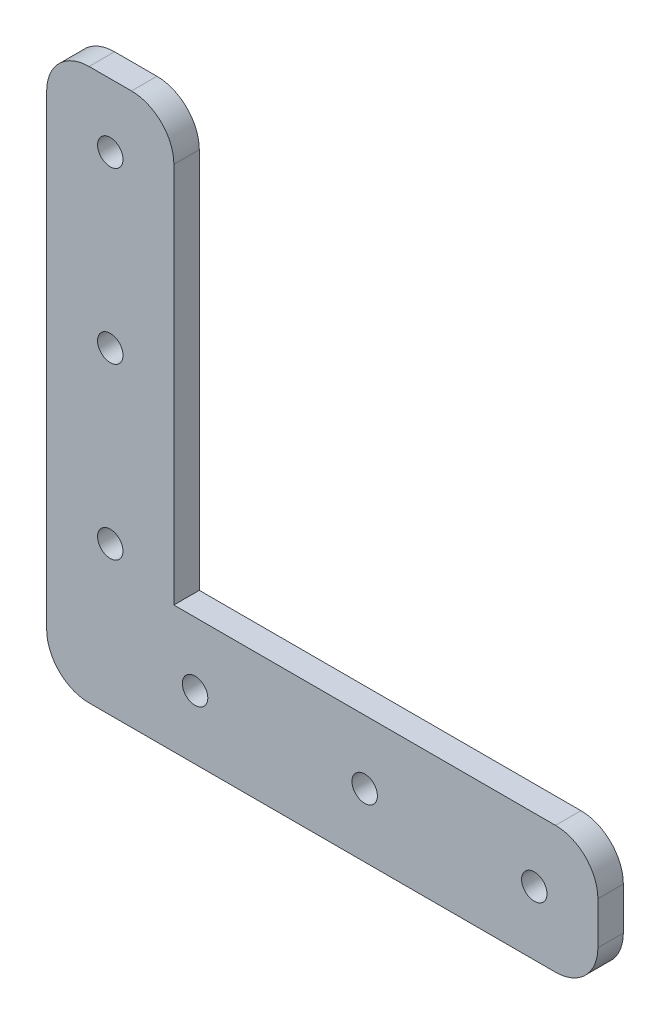
ISO-10303-21;
HEADER;
FILE_DESCRIPTION(('STEP AP214'),'2;1');
FILE_NAME('part.step','',(''),(''),'','','');
FILE_SCHEMA(('AUTOMOTIVE_DESIGN { 1 0 10303 214 1 1 1 1 }'));
ENDSEC;
DATA;
#1=APPLICATION_CONTEXT('core data for automotive mechanical design processes');
#2=APPLICATION_PROTOCOL_DEFINITION('international standard','automotive_design',2000,#1);
#3=PRODUCT_CONTEXT('',#1,'mechanical');
#4=PRODUCT('Part','Part','',(#3));
#5=PRODUCT_RELATED_PRODUCT_CATEGORY('part','',(#4));
#6=PRODUCT_DEFINITION_FORMATION('','',#4);
#7=PRODUCT_DEFINITION_CONTEXT('part definition',#1,'design');
#8=PRODUCT_DEFINITION('design','',#6,#7);
#9=PRODUCT_DEFINITION_SHAPE('','',#8);
#10=(LENGTH_UNIT() NAMED_UNIT(*) SI_UNIT(.MILLI.,.METRE.));
#11=(NAMED_UNIT(*) PLANE_ANGLE_UNIT() SI_UNIT($,.RADIAN.));
#12=(NAMED_UNIT(*) SI_UNIT($,.STERADIAN.) SOLID_ANGLE_UNIT());
#13=UNCERTAINTY_MEASURE_WITH_UNIT(LENGTH_MEASURE(1.E-05),#10,'distance_accuracy_value','');
#14=(GEOMETRIC_REPRESENTATION_CONTEXT(3) GLOBAL_UNCERTAINTY_ASSIGNED_CONTEXT((#13)) GLOBAL_UNIT_ASSIGNED_CONTEXT((#10,
#11,#12)) REPRESENTATION_CONTEXT('',''));
#15=CARTESIAN_POINT('',(0.,0.,0.));
#16=DIRECTION('',(0.,0.,1.));
#17=DIRECTION('',(1.,0.,0.));
#18=AXIS2_PLACEMENT_3D('',#15,#16,#17);
#19=CARTESIAN_POINT('',(0.,0.,3.));
#20=DIRECTION('',(0.,0.,-1.));
#21=DIRECTION('',(-1.,0.,0.));
#22=AXIS2_PLACEMENT_3D('',#19,#20,#21);
#23=PLANE('',#22);
#24=DIRECTION('',(0.,1.,0.));
#25=VECTOR('',#24,1.);
#26=CARTESIAN_POINT('',(65.,15.0000000000001,3.));
#27=LINE('',#26,#25);
#28=CARTESIAN_POINT('',(65.,5.,3.));
#29=VERTEX_POINT('',#28);
#30=CARTESIAN_POINT('',(65.,10.0000000000001,3.));
#31=VERTEX_POINT('',#30);
#32=EDGE_CURVE('E129',#29,#31,#27,.T.);
#33=ORIENTED_EDGE('',*,*,#32,.T.);
#34=CARTESIAN_POINT('',(60.,10.0000000000001,3.));
#35=DIRECTION('',(0.,0.,-1.));
#36=DIRECTION('',(-1.,0.,0.));
#37=AXIS2_PLACEMENT_3D('',#34,#35,#36);
#38=CIRCLE('',#37,5.);
#39=CARTESIAN_POINT('',(60.,15.0000000000001,3.));
#40=VERTEX_POINT('',#39);
#41=EDGE_CURVE('E125',#31,#40,#38,.F.);
#42=ORIENTED_EDGE('',*,*,#41,.T.);
#43=DIRECTION('',(-1.,0.,0.));
#44=VECTOR('',#43,1.);
#45=CARTESIAN_POINT('',(15.,15.,3.));
#46=LINE('',#45,#44);
#47=CARTESIAN_POINT('',(15.,15.,3.));
#48=VERTEX_POINT('',#47);
#49=EDGE_CURVE('E117',#40,#48,#46,.T.);
#50=ORIENTED_EDGE('',*,*,#49,.T.);
#51=DIRECTION('',(0.,1.,0.));
#52=VECTOR('',#51,1.);
#53=CARTESIAN_POINT('',(15.,65.,3.));
#54=LINE('',#53,#52);
#55=CARTESIAN_POINT('',(15.,60.,3.));
#56=VERTEX_POINT('',#55);
#57=EDGE_CURVE('E122',#48,#56,#54,.T.);
#58=ORIENTED_EDGE('',*,*,#57,.T.);
#59=CARTESIAN_POINT('',(9.99999999999999,60.,3.));
#60=DIRECTION('',(0.,0.,-1.));
#61=DIRECTION('',(-1.,0.,0.));
#62=AXIS2_PLACEMENT_3D('',#59,#60,#61);
#63=CIRCLE('',#62,5.);
#64=CARTESIAN_POINT('',(9.99999999999999,65.,3.));
#65=VERTEX_POINT('',#64);
#66=EDGE_CURVE('E188',#56,#65,#63,.F.);
#67=ORIENTED_EDGE('',*,*,#66,.T.);
#68=DIRECTION('',(-1.,0.,0.));
#69=VECTOR('',#68,1.);
#70=CARTESIAN_POINT('',(0.,65.,3.));
#71=LINE('',#70,#69);
#72=CARTESIAN_POINT('',(5.,65.,3.));
#73=VERTEX_POINT('',#72);
#74=EDGE_CURVE('E145',#65,#73,#71,.T.);
#75=ORIENTED_EDGE('',*,*,#74,.T.);
#76=CARTESIAN_POINT('',(5.,60.,3.));
#77=DIRECTION('',(0.,0.,-1.));
#78=DIRECTION('',(-1.,0.,0.));
#79=AXIS2_PLACEMENT_3D('',#76,#77,#78);
#80=CIRCLE('',#79,5.);
#81=CARTESIAN_POINT('',(0.,60.,3.));
#82=VERTEX_POINT('',#81);
#83=EDGE_CURVE('E55',#73,#82,#80,.F.);
#84=ORIENTED_EDGE('',*,*,#83,.T.);
#85=DIRECTION('',(0.,-1.,0.));
#86=VECTOR('',#85,1.);
#87=CARTESIAN_POINT('',(0.,0.,3.));
#88=LINE('',#87,#86);
#89=CARTESIAN_POINT('',(0.,5.,3.));
#90=VERTEX_POINT('',#89);
#91=EDGE_CURVE('E140',#82,#90,#88,.T.);
#92=ORIENTED_EDGE('',*,*,#91,.T.);
#93=CARTESIAN_POINT('',(5.,5.,3.));
#94=DIRECTION('',(0.,0.,-1.));
#95=DIRECTION('',(-1.,0.,0.));
#96=AXIS2_PLACEMENT_3D('',#93,#94,#95);
#97=CIRCLE('',#96,5.);
#98=CARTESIAN_POINT('',(5.,0.,3.));
#99=VERTEX_POINT('',#98);
#100=EDGE_CURVE('E186',#90,#99,#97,.F.);
#101=ORIENTED_EDGE('',*,*,#100,.T.);
#102=DIRECTION('',(1.,0.,0.));
#103=VECTOR('',#102,1.);
#104=CARTESIAN_POINT('',(65.,0.,3.));
#105=LINE('',#104,#103);
#106=CARTESIAN_POINT('',(60.,0.,3.));
#107=VERTEX_POINT('',#106);
#108=EDGE_CURVE('E165',#99,#107,#105,.T.);
#109=ORIENTED_EDGE('',*,*,#108,.T.);
#110=CARTESIAN_POINT('',(60.,5.,3.));
#111=DIRECTION('',(0.,0.,-1.));
#112=DIRECTION('',(-1.,0.,0.));
#113=AXIS2_PLACEMENT_3D('',#110,#111,#112);
#114=CIRCLE('',#113,5.);
#115=EDGE_CURVE('E184',#107,#29,#114,.F.);
#116=ORIENTED_EDGE('',*,*,#115,.T.);
#117=EDGE_LOOP('',(#33,#42,#50,#58,#67,#75,#84,#92,#101,#109,#116));
#118=FACE_BOUND('',#117,.T.);
#119=CARTESIAN_POINT('',(7.5,37.5,3.));
#120=DIRECTION('',(0.,0.,1.));
#121=DIRECTION('',(1.,0.,0.));
#122=AXIS2_PLACEMENT_3D('',#119,#120,#121);
#123=CIRCLE('',#122,1.5);
#124=CARTESIAN_POINT('',(9.00000000000001,37.5,3.));
#125=VERTEX_POINT('',#124);
#126=EDGE_CURVE('E155',#125,#125,#123,.T.);
#127=ORIENTED_EDGE('',*,*,#126,.F.);
#128=EDGE_LOOP('',(#127));
#129=FACE_BOUND('',#128,.T.);
#130=CARTESIAN_POINT('',(7.5,57.5,3.));
#131=DIRECTION('',(0.,0.,1.));
#132=DIRECTION('',(1.,0.,0.));
#133=AXIS2_PLACEMENT_3D('',#130,#131,#132);
#134=CIRCLE('',#133,1.5);
#135=CARTESIAN_POINT('',(9.,57.5,3.));
#136=VERTEX_POINT('',#135);
#137=EDGE_CURVE('E226',#136,#136,#134,.T.);
#138=ORIENTED_EDGE('',*,*,#137,.F.);
#139=EDGE_LOOP('',(#138));
#140=FACE_BOUND('',#139,.T.);
#141=CARTESIAN_POINT('',(7.50000000000001,17.5,3.));
#142=DIRECTION('',(0.,0.,1.));
#143=DIRECTION('',(1.,0.,0.));
#144=AXIS2_PLACEMENT_3D('',#141,#142,#143);
#145=CIRCLE('',#144,1.5);
#146=CARTESIAN_POINT('',(9.00000000000001,17.5,3.));
#147=VERTEX_POINT('',#146);
#148=EDGE_CURVE('E232',#147,#147,#145,.T.);
#149=ORIENTED_EDGE('',*,*,#148,.F.);
#150=EDGE_LOOP('',(#149));
#151=FACE_BOUND('',#150,.T.);
#152=CARTESIAN_POINT('',(57.5,7.49999999999987,3.));
#153=DIRECTION('',(0.,0.,1.));
#154=DIRECTION('',(-1.,0.,0.));
#155=AXIS2_PLACEMENT_3D('',#152,#153,#154);
#156=CIRCLE('',#155,1.5);
#157=CARTESIAN_POINT('',(56.,7.49999999999987,3.));
#158=VERTEX_POINT('',#157);
#159=EDGE_CURVE('E238',#158,#158,#156,.T.);
#160=ORIENTED_EDGE('',*,*,#159,.F.);
#161=EDGE_LOOP('',(#160));
#162=FACE_BOUND('',#161,.T.);
#163=CARTESIAN_POINT('',(37.5,7.49999999999992,3.));
#164=DIRECTION('',(0.,0.,1.));
#165=DIRECTION('',(-1.,0.,0.));
#166=AXIS2_PLACEMENT_3D('',#163,#164,#165);
#167=CIRCLE('',#166,1.5);
#168=CARTESIAN_POINT('',(36.,7.49999999999992,3.));
#169=VERTEX_POINT('',#168);
#170=EDGE_CURVE('E244',#169,#169,#167,.T.);
#171=ORIENTED_EDGE('',*,*,#170,.F.);
#172=EDGE_LOOP('',(#171));
#173=FACE_BOUND('',#172,.T.);
#174=CARTESIAN_POINT('',(17.5,7.49999999999997,3.));
#175=DIRECTION('',(0.,0.,1.));
#176=DIRECTION('',(-1.,0.,0.));
#177=AXIS2_PLACEMENT_3D('',#174,#175,#176);
#178=CIRCLE('',#177,1.5);
#179=CARTESIAN_POINT('',(16.,7.49999999999997,3.));
#180=VERTEX_POINT('',#179);
#181=EDGE_CURVE('E250',#180,#180,#178,.T.);
#182=ORIENTED_EDGE('',*,*,#181,.F.);
#183=EDGE_LOOP('',(#182));
#184=FACE_BOUND('',#183,.T.);
#185=ADVANCED_FACE('F35',(#118,#129,#140,#151,#162,#173,#184),#23,.F.);
#186=CARTESIAN_POINT('',(0.,0.,0.));
#187=DIRECTION('',(0.,0.,-1.));
#188=DIRECTION('',(-1.,0.,0.));
#189=AXIS2_PLACEMENT_3D('',#186,#187,#188);
#190=PLANE('',#189);
#191=CARTESIAN_POINT('',(37.5,7.49999999999992,0.));
#192=DIRECTION('',(0.,0.,1.));
#193=DIRECTION('',(-1.,0.,0.));
#194=AXIS2_PLACEMENT_3D('',#191,#192,#193);
#195=CIRCLE('',#194,1.5);
#196=CARTESIAN_POINT('',(36.,7.49999999999992,0.));
#197=VERTEX_POINT('',#196);
#198=EDGE_CURVE('E247',#197,#197,#195,.T.);
#199=ORIENTED_EDGE('',*,*,#198,.T.);
#200=EDGE_LOOP('',(#199));
#201=FACE_BOUND('',#200,.T.);
#202=CARTESIAN_POINT('',(7.50000000000001,17.5,0.));
#203=DIRECTION('',(0.,0.,1.));
#204=DIRECTION('',(1.,0.,0.));
#205=AXIS2_PLACEMENT_3D('',#202,#203,#204);
#206=CIRCLE('',#205,1.5);
#207=CARTESIAN_POINT('',(9.00000000000001,17.5,0.));
#208=VERTEX_POINT('',#207);
#209=EDGE_CURVE('E235',#208,#208,#206,.T.);
#210=ORIENTED_EDGE('',*,*,#209,.T.);
#211=EDGE_LOOP('',(#210));
#212=FACE_BOUND('',#211,.T.);
#213=CARTESIAN_POINT('',(7.5,37.5,0.));
#214=DIRECTION('',(0.,0.,1.));
#215=DIRECTION('',(1.,0.,0.));
#216=AXIS2_PLACEMENT_3D('',#213,#214,#215);
#217=CIRCLE('',#216,1.5);
#218=CARTESIAN_POINT('',(9.00000000000001,37.5,0.));
#219=VERTEX_POINT('',#218);
#220=EDGE_CURVE('E223',#219,#219,#217,.T.);
#221=ORIENTED_EDGE('',*,*,#220,.T.);
#222=EDGE_LOOP('',(#221));
#223=FACE_BOUND('',#222,.T.);
#224=DIRECTION('',(-1.,0.,0.));
#225=VECTOR('',#224,1.);
#226=CARTESIAN_POINT('',(15.,15.,0.));
#227=LINE('',#226,#225);
#228=CARTESIAN_POINT('',(60.,15.0000000000001,0.));
#229=VERTEX_POINT('',#228);
#230=CARTESIAN_POINT('',(15.,15.,0.));
#231=VERTEX_POINT('',#230);
#232=EDGE_CURVE('E135',#229,#231,#227,.T.);
#233=ORIENTED_EDGE('',*,*,#232,.F.);
#234=CARTESIAN_POINT('',(60.,10.0000000000001,0.));
#235=DIRECTION('',(0.,0.,-1.));
#236=DIRECTION('',(-1.,0.,0.));
#237=AXIS2_PLACEMENT_3D('',#234,#235,#236);
#238=CIRCLE('',#237,5.);
#239=CARTESIAN_POINT('',(65.,10.0000000000001,0.));
#240=VERTEX_POINT('',#239);
#241=EDGE_CURVE('E176',#229,#240,#238,.T.);
#242=ORIENTED_EDGE('',*,*,#241,.T.);
#243=DIRECTION('',(0.,1.,0.));
#244=VECTOR('',#243,1.);
#245=CARTESIAN_POINT('',(65.,15.0000000000001,0.));
#246=LINE('',#245,#244);
#247=CARTESIAN_POINT('',(65.,5.,0.));
#248=VERTEX_POINT('',#247);
#249=EDGE_CURVE('E154',#248,#240,#246,.T.);
#250=ORIENTED_EDGE('',*,*,#249,.F.);
#251=CARTESIAN_POINT('',(60.,5.,0.));
#252=DIRECTION('',(0.,0.,-1.));
#253=DIRECTION('',(-1.,0.,0.));
#254=AXIS2_PLACEMENT_3D('',#251,#252,#253);
#255=CIRCLE('',#254,5.);
#256=CARTESIAN_POINT('',(60.,0.,0.));
#257=VERTEX_POINT('',#256);
#258=EDGE_CURVE('E170',#248,#257,#255,.T.);
#259=ORIENTED_EDGE('',*,*,#258,.T.);
#260=DIRECTION('',(1.,0.,0.));
#261=VECTOR('',#260,1.);
#262=CARTESIAN_POINT('',(65.,0.,0.));
#263=LINE('',#262,#261);
#264=CARTESIAN_POINT('',(5.,0.,0.));
#265=VERTEX_POINT('',#264);
#266=EDGE_CURVE('E151',#265,#257,#263,.T.);
#267=ORIENTED_EDGE('',*,*,#266,.F.);
#268=CARTESIAN_POINT('',(5.,5.,0.));
#269=DIRECTION('',(0.,0.,-1.));
#270=DIRECTION('',(-1.,0.,0.));
#271=AXIS2_PLACEMENT_3D('',#268,#269,#270);
#272=CIRCLE('',#271,5.);
#273=CARTESIAN_POINT('',(0.,5.,0.));
#274=VERTEX_POINT('',#273);
#275=EDGE_CURVE('E172',#265,#274,#272,.T.);
#276=ORIENTED_EDGE('',*,*,#275,.T.);
#277=DIRECTION('',(0.,-1.,0.));
#278=VECTOR('',#277,1.);
#279=CARTESIAN_POINT('',(0.,0.,0.));
#280=LINE('',#279,#278);
#281=CARTESIAN_POINT('',(0.,60.,0.));
#282=VERTEX_POINT('',#281);
#283=EDGE_CURVE('E164',#282,#274,#280,.T.);
#284=ORIENTED_EDGE('',*,*,#283,.F.);
#285=CARTESIAN_POINT('',(5.,60.,0.));
#286=DIRECTION('',(0.,0.,-1.));
#287=DIRECTION('',(-1.,0.,0.));
#288=AXIS2_PLACEMENT_3D('',#285,#286,#287);
#289=CIRCLE('',#288,5.);
#290=CARTESIAN_POINT('',(5.,65.,0.));
#291=VERTEX_POINT('',#290);
#292=EDGE_CURVE('E168',#282,#291,#289,.T.);
#293=ORIENTED_EDGE('',*,*,#292,.T.);
#294=DIRECTION('',(-1.,0.,0.));
#295=VECTOR('',#294,1.);
#296=CARTESIAN_POINT('',(0.,65.,0.));
#297=LINE('',#296,#295);
#298=CARTESIAN_POINT('',(9.99999999999999,65.,0.));
#299=VERTEX_POINT('',#298);
#300=EDGE_CURVE('E161',#299,#291,#297,.T.);
#301=ORIENTED_EDGE('',*,*,#300,.F.);
#302=CARTESIAN_POINT('',(9.99999999999999,60.,0.));
#303=DIRECTION('',(0.,0.,-1.));
#304=DIRECTION('',(-1.,0.,0.));
#305=AXIS2_PLACEMENT_3D('',#302,#303,#304);
#306=CIRCLE('',#305,5.);
#307=CARTESIAN_POINT('',(15.,60.,0.));
#308=VERTEX_POINT('',#307);
#309=EDGE_CURVE('E174',#299,#308,#306,.T.);
#310=ORIENTED_EDGE('',*,*,#309,.T.);
#311=DIRECTION('',(0.,1.,0.));
#312=VECTOR('',#311,1.);
#313=CARTESIAN_POINT('',(15.,65.,0.));
#314=LINE('',#313,#312);
#315=EDGE_CURVE('E159',#231,#308,#314,.T.);
#316=ORIENTED_EDGE('',*,*,#315,.F.);
#317=EDGE_LOOP('',(#233,#242,#250,#259,#267,#276,#284,#293,#301,#310,#316));
#318=FACE_BOUND('',#317,.T.);
#319=CARTESIAN_POINT('',(7.5,57.5,0.));
#320=DIRECTION('',(0.,0.,1.));
#321=DIRECTION('',(1.,0.,0.));
#322=AXIS2_PLACEMENT_3D('',#319,#320,#321);
#323=CIRCLE('',#322,1.5);
#324=CARTESIAN_POINT('',(9.,57.5,0.));
#325=VERTEX_POINT('',#324);
#326=EDGE_CURVE('E229',#325,#325,#323,.T.);
#327=ORIENTED_EDGE('',*,*,#326,.T.);
#328=EDGE_LOOP('',(#327));
#329=FACE_BOUND('',#328,.T.);
#330=CARTESIAN_POINT('',(57.5,7.49999999999987,0.));
#331=DIRECTION('',(0.,0.,1.));
#332=DIRECTION('',(-1.,0.,0.));
#333=AXIS2_PLACEMENT_3D('',#330,#331,#332);
#334=CIRCLE('',#333,1.5);
#335=CARTESIAN_POINT('',(56.,7.49999999999987,0.));
#336=VERTEX_POINT('',#335);
#337=EDGE_CURVE('E241',#336,#336,#334,.T.);
#338=ORIENTED_EDGE('',*,*,#337,.T.);
#339=EDGE_LOOP('',(#338));
#340=FACE_BOUND('',#339,.T.);
#341=CARTESIAN_POINT('',(17.5,7.49999999999997,0.));
#342=DIRECTION('',(0.,0.,1.));
#343=DIRECTION('',(-1.,0.,0.));
#344=AXIS2_PLACEMENT_3D('',#341,#342,#343);
#345=CIRCLE('',#344,1.5);
#346=CARTESIAN_POINT('',(16.,7.49999999999997,0.));
#347=VERTEX_POINT('',#346);
#348=EDGE_CURVE('E253',#347,#347,#345,.T.);
#349=ORIENTED_EDGE('',*,*,#348,.T.);
#350=EDGE_LOOP('',(#349));
#351=FACE_BOUND('',#350,.T.);
#352=ADVANCED_FACE('F207',(#201,#212,#223,#318,#329,#340,#351),#190,.T.);
#353=CARTESIAN_POINT('',(65.,0.,3.));
#354=DIRECTION('',(0.,1.,0.));
#355=DIRECTION('',(-1.,0.,0.));
#356=AXIS2_PLACEMENT_3D('',#353,#354,#355);
#357=PLANE('',#356);
#358=ORIENTED_EDGE('',*,*,#108,.F.);
#359=DIRECTION('',(0.,0.,-1.));
#360=VECTOR('',#359,1.);
#361=CARTESIAN_POINT('',(5.,0.,3.));
#362=LINE('',#361,#360);
#363=EDGE_CURVE('E199',#99,#265,#362,.T.);
#364=ORIENTED_EDGE('',*,*,#363,.T.);
#365=ORIENTED_EDGE('',*,*,#266,.T.);
#366=DIRECTION('',(0.,0.,-1.));
#367=VECTOR('',#366,1.);
#368=CARTESIAN_POINT('',(60.,0.,3.));
#369=LINE('',#368,#367);
#370=EDGE_CURVE('E197',#257,#107,#369,.F.);
#371=ORIENTED_EDGE('',*,*,#370,.T.);
#372=EDGE_LOOP('',(#358,#364,#365,#371));
#373=FACE_BOUND('',#372,.T.);
#374=ADVANCED_FACE('F217',(#373),#357,.F.);
#375=CARTESIAN_POINT('',(65.,15.0000000000001,3.));
#376=DIRECTION('',(-1.,0.,0.));
#377=DIRECTION('',(0.,0.,1.));
#378=AXIS2_PLACEMENT_3D('',#375,#376,#377);
#379=PLANE('',#378);
#380=ORIENTED_EDGE('',*,*,#249,.T.);
#381=DIRECTION('',(0.,0.,-1.));
#382=VECTOR('',#381,1.);
#383=CARTESIAN_POINT('',(65.,10.0000000000001,3.));
#384=LINE('',#383,#382);
#385=EDGE_CURVE('E181',#240,#31,#384,.F.);
#386=ORIENTED_EDGE('',*,*,#385,.T.);
#387=ORIENTED_EDGE('',*,*,#32,.F.);
#388=DIRECTION('',(0.,0.,-1.));
#389=VECTOR('',#388,1.);
#390=CARTESIAN_POINT('',(65.,5.,3.));
#391=LINE('',#390,#389);
#392=EDGE_CURVE('E178',#29,#248,#391,.T.);
#393=ORIENTED_EDGE('',*,*,#392,.T.);
#394=EDGE_LOOP('',(#380,#386,#387,#393));
#395=FACE_BOUND('',#394,.T.);
#396=ADVANCED_FACE('F283',(#395),#379,.F.);
#397=CARTESIAN_POINT('',(15.,15.,3.));
#398=DIRECTION('',(0.,-1.,0.));
#399=DIRECTION('',(1.,0.,0.));
#400=AXIS2_PLACEMENT_3D('',#397,#398,#399);
#401=PLANE('',#400);
#402=ORIENTED_EDGE('',*,*,#49,.F.);
#403=DIRECTION('',(0.,0.,-1.));
#404=VECTOR('',#403,1.);
#405=CARTESIAN_POINT('',(60.,15.0000000000001,3.));
#406=LINE('',#405,#404);
#407=EDGE_CURVE('E139',#40,#229,#406,.T.);
#408=ORIENTED_EDGE('',*,*,#407,.T.);
#409=ORIENTED_EDGE('',*,*,#232,.T.);
#410=DIRECTION('',(0.,0.,-1.));
#411=VECTOR('',#410,1.);
#412=CARTESIAN_POINT('',(15.,15.,3.));
#413=LINE('',#412,#411);
#414=EDGE_CURVE('E132',#48,#231,#413,.T.);
#415=ORIENTED_EDGE('',*,*,#414,.F.);
#416=EDGE_LOOP('',(#402,#408,#409,#415));
#417=FACE_BOUND('',#416,.T.);
#418=ADVANCED_FACE('F133',(#417),#401,.F.);
#419=CARTESIAN_POINT('',(15.,65.,3.));
#420=DIRECTION('',(-1.,0.,0.));
#421=DIRECTION('',(0.,-1.,0.));
#422=AXIS2_PLACEMENT_3D('',#419,#420,#421);
#423=PLANE('',#422);
#424=ORIENTED_EDGE('',*,*,#315,.T.);
#425=DIRECTION('',(0.,0.,-1.));
#426=VECTOR('',#425,1.);
#427=CARTESIAN_POINT('',(15.,60.,3.));
#428=LINE('',#427,#426);
#429=EDGE_CURVE('E144',#308,#56,#428,.F.);
#430=ORIENTED_EDGE('',*,*,#429,.T.);
#431=ORIENTED_EDGE('',*,*,#57,.F.);
#432=ORIENTED_EDGE('',*,*,#414,.T.);
#433=EDGE_LOOP('',(#424,#430,#431,#432));
#434=FACE_BOUND('',#433,.T.);
#435=ADVANCED_FACE('F142',(#434),#423,.F.);
#436=CARTESIAN_POINT('',(0.,65.,3.));
#437=DIRECTION('',(0.,-1.,0.));
#438=DIRECTION('',(0.,0.,-1.));
#439=AXIS2_PLACEMENT_3D('',#436,#437,#438);
#440=PLANE('',#439);
#441=ORIENTED_EDGE('',*,*,#74,.F.);
#442=DIRECTION('',(0.,0.,-1.));
#443=VECTOR('',#442,1.);
#444=CARTESIAN_POINT('',(9.99999999999999,65.,3.));
#445=LINE('',#444,#443);
#446=EDGE_CURVE('E193',#65,#299,#445,.T.);
#447=ORIENTED_EDGE('',*,*,#446,.T.);
#448=ORIENTED_EDGE('',*,*,#300,.T.);
#449=DIRECTION('',(0.,0.,-1.));
#450=VECTOR('',#449,1.);
#451=CARTESIAN_POINT('',(5.,65.,3.));
#452=LINE('',#451,#450);
#453=EDGE_CURVE('E191',#291,#73,#452,.F.);
#454=ORIENTED_EDGE('',*,*,#453,.T.);
#455=EDGE_LOOP('',(#441,#447,#448,#454));
#456=FACE_BOUND('',#455,.T.);
#457=ADVANCED_FACE('F275',(#456),#440,.F.);
#458=CARTESIAN_POINT('',(0.,0.,3.));
#459=DIRECTION('',(1.,0.,0.));
#460=DIRECTION('',(0.,0.,-1.));
#461=AXIS2_PLACEMENT_3D('',#458,#459,#460);
#462=PLANE('',#461);
#463=ORIENTED_EDGE('',*,*,#283,.T.);
#464=DIRECTION('',(0.,0.,-1.));
#465=VECTOR('',#464,1.);
#466=CARTESIAN_POINT('',(0.,5.,3.));
#467=LINE('',#466,#465);
#468=EDGE_CURVE('E11',#274,#90,#467,.F.);
#469=ORIENTED_EDGE('',*,*,#468,.T.);
#470=ORIENTED_EDGE('',*,*,#91,.F.);
#471=DIRECTION('',(0.,0.,-1.));
#472=VECTOR('',#471,1.);
#473=CARTESIAN_POINT('',(0.,60.,3.));
#474=LINE('',#473,#472);
#475=EDGE_CURVE('E43',#82,#282,#474,.T.);
#476=ORIENTED_EDGE('',*,*,#475,.T.);
#477=EDGE_LOOP('',(#463,#469,#470,#476));
#478=FACE_BOUND('',#477,.T.);
#479=ADVANCED_FACE('F204',(#478),#462,.F.);
#480=CARTESIAN_POINT('',(7.5,37.5,3.));
#481=DIRECTION('',(0.,0.,-1.));
#482=DIRECTION('',(-1.,0.,0.));
#483=AXIS2_PLACEMENT_3D('',#480,#481,#482);
#484=CYLINDRICAL_SURFACE('',#483,1.5);
#485=ORIENTED_EDGE('',*,*,#126,.T.);
#486=EDGE_LOOP('',(#485));
#487=FACE_BOUND('',#486,.T.);
#488=ORIENTED_EDGE('',*,*,#220,.F.);
#489=EDGE_LOOP('',(#488));
#490=FACE_BOUND('',#489,.T.);
#491=ADVANCED_FACE('F270',(#487,#490),#484,.F.);
#492=CARTESIAN_POINT('',(7.5,57.5,3.));
#493=DIRECTION('',(0.,0.,-1.));
#494=DIRECTION('',(-1.,0.,0.));
#495=AXIS2_PLACEMENT_3D('',#492,#493,#494);
#496=CYLINDRICAL_SURFACE('',#495,1.5);
#497=ORIENTED_EDGE('',*,*,#137,.T.);
#498=EDGE_LOOP('',(#497));
#499=FACE_BOUND('',#498,.T.);
#500=ORIENTED_EDGE('',*,*,#326,.F.);
#501=EDGE_LOOP('',(#500));
#502=FACE_BOUND('',#501,.T.);
#503=ADVANCED_FACE('F423',(#499,#502),#496,.F.);
#504=CARTESIAN_POINT('',(7.50000000000001,17.5,3.));
#505=DIRECTION('',(0.,0.,-1.));
#506=DIRECTION('',(-1.,0.,0.));
#507=AXIS2_PLACEMENT_3D('',#504,#505,#506);
#508=CYLINDRICAL_SURFACE('',#507,1.5);
#509=ORIENTED_EDGE('',*,*,#148,.T.);
#510=EDGE_LOOP('',(#509));
#511=FACE_BOUND('',#510,.T.);
#512=ORIENTED_EDGE('',*,*,#209,.F.);
#513=EDGE_LOOP('',(#512));
#514=FACE_BOUND('',#513,.T.);
#515=ADVANCED_FACE('F413',(#511,#514),#508,.F.);
#516=CARTESIAN_POINT('',(57.5,7.49999999999987,3.));
#517=DIRECTION('',(0.,0.,-1.));
#518=DIRECTION('',(-1.,0.,0.));
#519=AXIS2_PLACEMENT_3D('',#516,#517,#518);
#520=CYLINDRICAL_SURFACE('',#519,1.5);
#521=ORIENTED_EDGE('',*,*,#159,.T.);
#522=EDGE_LOOP('',(#521));
#523=FACE_BOUND('',#522,.T.);
#524=ORIENTED_EDGE('',*,*,#337,.F.);
#525=EDGE_LOOP('',(#524));
#526=FACE_BOUND('',#525,.T.);
#527=ADVANCED_FACE('F403',(#523,#526),#520,.F.);
#528=CARTESIAN_POINT('',(37.5,7.49999999999992,3.));
#529=DIRECTION('',(0.,0.,-1.));
#530=DIRECTION('',(-1.,0.,0.));
#531=AXIS2_PLACEMENT_3D('',#528,#529,#530);
#532=CYLINDRICAL_SURFACE('',#531,1.5);
#533=ORIENTED_EDGE('',*,*,#170,.T.);
#534=EDGE_LOOP('',(#533));
#535=FACE_BOUND('',#534,.T.);
#536=ORIENTED_EDGE('',*,*,#198,.F.);
#537=EDGE_LOOP('',(#536));
#538=FACE_BOUND('',#537,.T.);
#539=ADVANCED_FACE('F394',(#535,#538),#532,.F.);
#540=CARTESIAN_POINT('',(17.5,7.49999999999997,3.));
#541=DIRECTION('',(0.,0.,-1.));
#542=DIRECTION('',(-1.,0.,0.));
#543=AXIS2_PLACEMENT_3D('',#540,#541,#542);
#544=CYLINDRICAL_SURFACE('',#543,1.5);
#545=ORIENTED_EDGE('',*,*,#181,.T.);
#546=EDGE_LOOP('',(#545));
#547=FACE_BOUND('',#546,.T.);
#548=ORIENTED_EDGE('',*,*,#348,.F.);
#549=EDGE_LOOP('',(#548));
#550=FACE_BOUND('',#549,.T.);
#551=ADVANCED_FACE('F259',(#547,#550),#544,.F.);
#552=CARTESIAN_POINT('',(60.,10.0000000000001,3.));
#553=DIRECTION('',(0.,0.,-1.));
#554=DIRECTION('',(-1.,0.,0.));
#555=AXIS2_PLACEMENT_3D('',#552,#553,#554);
#556=CYLINDRICAL_SURFACE('',#555,5.);
#557=ORIENTED_EDGE('',*,*,#41,.F.);
#558=ORIENTED_EDGE('',*,*,#385,.F.);
#559=ORIENTED_EDGE('',*,*,#241,.F.);
#560=ORIENTED_EDGE('',*,*,#407,.F.);
#561=EDGE_LOOP('',(#557,#558,#559,#560));
#562=FACE_BOUND('',#561,.T.);
#563=ADVANCED_FACE('F289',(#562),#556,.T.);
#564=CARTESIAN_POINT('',(9.99999999999999,60.,3.));
#565=DIRECTION('',(0.,0.,-1.));
#566=DIRECTION('',(-1.,0.,0.));
#567=AXIS2_PLACEMENT_3D('',#564,#565,#566);
#568=CYLINDRICAL_SURFACE('',#567,5.);
#569=ORIENTED_EDGE('',*,*,#66,.F.);
#570=ORIENTED_EDGE('',*,*,#429,.F.);
#571=ORIENTED_EDGE('',*,*,#309,.F.);
#572=ORIENTED_EDGE('',*,*,#446,.F.);
#573=EDGE_LOOP('',(#569,#570,#571,#572));
#574=FACE_BOUND('',#573,.T.);
#575=ADVANCED_FACE('F292',(#574),#568,.T.);
#576=CARTESIAN_POINT('',(5.,5.,3.));
#577=DIRECTION('',(0.,0.,-1.));
#578=DIRECTION('',(-1.,0.,0.));
#579=AXIS2_PLACEMENT_3D('',#576,#577,#578);
#580=CYLINDRICAL_SURFACE('',#579,5.);
#581=ORIENTED_EDGE('',*,*,#100,.F.);
#582=ORIENTED_EDGE('',*,*,#468,.F.);
#583=ORIENTED_EDGE('',*,*,#275,.F.);
#584=ORIENTED_EDGE('',*,*,#363,.F.);
#585=EDGE_LOOP('',(#581,#582,#583,#584));
#586=FACE_BOUND('',#585,.T.);
#587=ADVANCED_FACE('F214',(#586),#580,.T.);
#588=CARTESIAN_POINT('',(60.,5.,3.));
#589=DIRECTION('',(0.,0.,-1.));
#590=DIRECTION('',(-1.,0.,0.));
#591=AXIS2_PLACEMENT_3D('',#588,#589,#590);
#592=CYLINDRICAL_SURFACE('',#591,5.);
#593=ORIENTED_EDGE('',*,*,#115,.F.);
#594=ORIENTED_EDGE('',*,*,#370,.F.);
#595=ORIENTED_EDGE('',*,*,#258,.F.);
#596=ORIENTED_EDGE('',*,*,#392,.F.);
#597=EDGE_LOOP('',(#593,#594,#595,#596));
#598=FACE_BOUND('',#597,.T.);
#599=ADVANCED_FACE('F298',(#598),#592,.T.);
#600=CARTESIAN_POINT('',(5.,60.,3.));
#601=DIRECTION('',(0.,0.,-1.));
#602=DIRECTION('',(-1.,0.,0.));
#603=AXIS2_PLACEMENT_3D('',#600,#601,#602);
#604=CYLINDRICAL_SURFACE('',#603,5.);
#605=ORIENTED_EDGE('',*,*,#83,.F.);
#606=ORIENTED_EDGE('',*,*,#453,.F.);
#607=ORIENTED_EDGE('',*,*,#292,.F.);
#608=ORIENTED_EDGE('',*,*,#475,.F.);
#609=EDGE_LOOP('',(#605,#606,#607,#608));
#610=FACE_BOUND('',#609,.T.);
#611=ADVANCED_FACE('F37',(#610),#604,.T.);
#612=CLOSED_SHELL('',(#185,#352,#374,#396,#418,#435,#457,#479,#491,#503,#515,#527,#539,#551,
#563,#575,#587,#599,#611));
#613=MANIFOLD_SOLID_BREP('B2',#612);
#614=ADVANCED_BREP_SHAPE_REPRESENTATION('',(#18,#613),#14);
#615=SHAPE_DEFINITION_REPRESENTATION(#9,#614);
ENDSEC;
END-ISO-10303-21;
